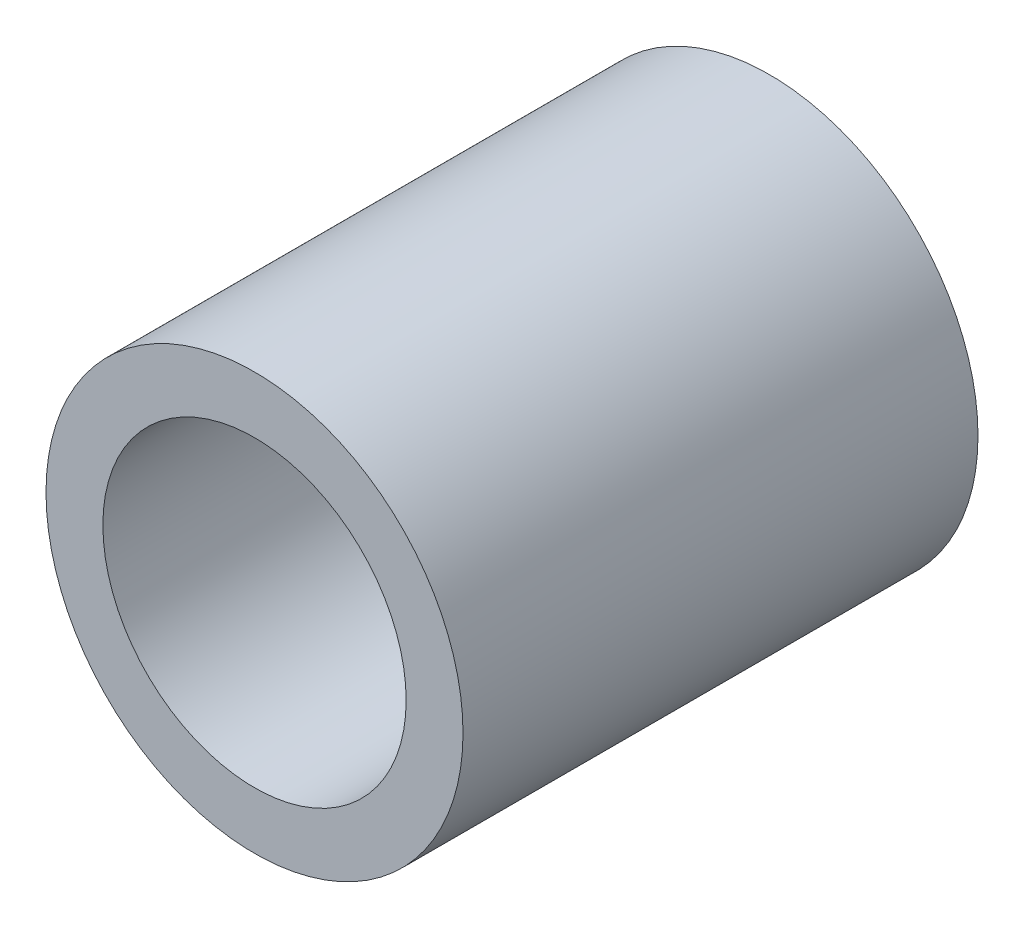
ISO-10303-21;
HEADER;
FILE_DESCRIPTION(('STEP AP214'),'2;1');
FILE_NAME('part.step','',(''),(''),'','','');
FILE_SCHEMA(('AUTOMOTIVE_DESIGN { 1 0 10303 214 1 1 1 1 }'));
ENDSEC;
DATA;
#1=APPLICATION_CONTEXT('core data for automotive mechanical design processes');
#2=APPLICATION_PROTOCOL_DEFINITION('international standard','automotive_design',2000,#1);
#3=PRODUCT_CONTEXT('',#1,'mechanical');
#4=PRODUCT('Part','Part','',(#3));
#5=PRODUCT_RELATED_PRODUCT_CATEGORY('part','',(#4));
#6=PRODUCT_DEFINITION_FORMATION('','',#4);
#7=PRODUCT_DEFINITION_CONTEXT('part definition',#1,'design');
#8=PRODUCT_DEFINITION('design','',#6,#7);
#9=PRODUCT_DEFINITION_SHAPE('','',#8);
#10=(LENGTH_UNIT() NAMED_UNIT(*) SI_UNIT(.MILLI.,.METRE.));
#11=(NAMED_UNIT(*) PLANE_ANGLE_UNIT() SI_UNIT($,.RADIAN.));
#12=(NAMED_UNIT(*) SI_UNIT($,.STERADIAN.) SOLID_ANGLE_UNIT());
#13=UNCERTAINTY_MEASURE_WITH_UNIT(LENGTH_MEASURE(1.E-05),#10,'distance_accuracy_value','');
#14=(GEOMETRIC_REPRESENTATION_CONTEXT(3) GLOBAL_UNCERTAINTY_ASSIGNED_CONTEXT((#13)) GLOBAL_UNIT_ASSIGNED_CONTEXT((#10,
#11,#12)) REPRESENTATION_CONTEXT('',''));
#15=CARTESIAN_POINT('',(0.,0.,0.));
#16=DIRECTION('',(0.,0.,1.));
#17=DIRECTION('',(1.,0.,0.));
#18=AXIS2_PLACEMENT_3D('',#15,#16,#17);
#19=CARTESIAN_POINT('',(0.,0.,0.));
#20=DIRECTION('',(0.,0.,1.));
#21=DIRECTION('',(1.,0.,0.));
#22=AXIS2_PLACEMENT_3D('',#19,#20,#21);
#23=PLANE('',#22);
#24=CARTESIAN_POINT('',(0.,0.,0.));
#25=DIRECTION('',(0.,0.,1.));
#26=DIRECTION('',(1.,0.,0.));
#27=AXIS2_PLACEMENT_3D('',#24,#25,#26);
#28=CIRCLE('',#27,8.73125);
#29=CARTESIAN_POINT('',(-8.73125,0.,0.));
#30=VERTEX_POINT('',#29);
#31=EDGE_CURVE('E38',#30,#30,#28,.T.);
#32=ORIENTED_EDGE('',*,*,#31,.F.);
#33=EDGE_LOOP('',(#32));
#34=FACE_BOUND('',#33,.T.);
#35=CARTESIAN_POINT('',(0.,0.,0.));
#36=DIRECTION('',(0.,0.,1.));
#37=DIRECTION('',(1.,0.,0.));
#38=AXIS2_PLACEMENT_3D('',#35,#36,#37);
#39=CIRCLE('',#38,6.35);
#40=CARTESIAN_POINT('',(-6.35,0.,0.));
#41=VERTEX_POINT('',#40);
#42=EDGE_CURVE('E47',#41,#41,#39,.T.);
#43=ORIENTED_EDGE('',*,*,#42,.T.);
#44=EDGE_LOOP('',(#43));
#45=FACE_BOUND('',#44,.T.);
#46=ADVANCED_FACE('F31',(#34,#45),#23,.F.);
#47=CARTESIAN_POINT('',(0.,0.,46.2602535329402));
#48=DIRECTION('',(0.,0.,-1.));
#49=DIRECTION('',(-1.,0.,0.));
#50=AXIS2_PLACEMENT_3D('',#47,#48,#49);
#51=CYLINDRICAL_SURFACE('',#50,8.73125);
#52=CARTESIAN_POINT('',(0.,0.,21.5645492));
#53=DIRECTION('',(0.,0.,-1.));
#54=DIRECTION('',(0.,1.,0.));
#55=AXIS2_PLACEMENT_3D('',#52,#53,#54);
#56=CIRCLE('',#55,8.73125);
#57=CARTESIAN_POINT('',(-8.73125,0.,21.5645492));
#58=VERTEX_POINT('',#57);
#59=EDGE_CURVE('E42',#58,#58,#56,.T.);
#60=CARTESIAN_POINT('',(-8.73125,0.,21.5645492));
#61=CARTESIAN_POINT('',(-8.73125,0.,21.3399184791667));
#62=CARTESIAN_POINT('',(-8.73125,0.,21.1152877583333));
#63=CARTESIAN_POINT('',(-8.73125,0.,20.6660263166667));
#64=CARTESIAN_POINT('',(-8.73125,0.,20.4413955958333));
#65=CARTESIAN_POINT('',(-8.73125,0.,19.9921341541667));
#66=CARTESIAN_POINT('',(-8.73125,0.,19.7675034333333));
#67=CARTESIAN_POINT('',(-8.73125,0.,19.3182419916667));
#68=CARTESIAN_POINT('',(-8.73125,0.,19.0936112708333));
#69=CARTESIAN_POINT('',(-8.73125,0.,18.6443498291667));
#70=CARTESIAN_POINT('',(-8.73125,0.,18.4197191083333));
#71=CARTESIAN_POINT('',(-8.73125,0.,17.9704576666667));
#72=CARTESIAN_POINT('',(-8.73125,0.,17.7458269458333));
#73=CARTESIAN_POINT('',(-8.73125,0.,17.2965655041667));
#74=CARTESIAN_POINT('',(-8.73125,0.,17.0719347833333));
#75=CARTESIAN_POINT('',(-8.73125,0.,16.6226733416667));
#76=CARTESIAN_POINT('',(-8.73125,0.,16.3980426208333));
#77=CARTESIAN_POINT('',(-8.73125,0.,15.9487811791667));
#78=CARTESIAN_POINT('',(-8.73125,0.,15.7241504583333));
#79=CARTESIAN_POINT('',(-8.73125,0.,15.2748890166667));
#80=CARTESIAN_POINT('',(-8.73125,0.,15.0502582958333));
#81=CARTESIAN_POINT('',(-8.73125,0.,14.6009968541667));
#82=CARTESIAN_POINT('',(-8.73125,0.,14.3763661333333));
#83=CARTESIAN_POINT('',(-8.73125,0.,13.9271046916667));
#84=CARTESIAN_POINT('',(-8.73125,0.,13.7024739708333));
#85=CARTESIAN_POINT('',(-8.73125,0.,13.2532125291667));
#86=CARTESIAN_POINT('',(-8.73125,0.,13.0285818083333));
#87=CARTESIAN_POINT('',(-8.73125,0.,12.5793203666667));
#88=CARTESIAN_POINT('',(-8.73125,0.,12.3546896458333));
#89=CARTESIAN_POINT('',(-8.73125,0.,11.9054282041667));
#90=CARTESIAN_POINT('',(-8.73125,0.,11.6807974833333));
#91=CARTESIAN_POINT('',(-8.73125,0.,11.2315360416667));
#92=CARTESIAN_POINT('',(-8.73125,0.,11.0069053208333));
#93=CARTESIAN_POINT('',(-8.73125,0.,10.5576438791667));
#94=CARTESIAN_POINT('',(-8.73125,0.,10.3330131583333));
#95=CARTESIAN_POINT('',(-8.73125,0.,9.88375171666667));
#96=CARTESIAN_POINT('',(-8.73125,0.,9.65912099583334));
#97=CARTESIAN_POINT('',(-8.73125,0.,9.20985955416667));
#98=CARTESIAN_POINT('',(-8.73125,0.,8.98522883333334));
#99=CARTESIAN_POINT('',(-8.73125,0.,8.53596739166667));
#100=CARTESIAN_POINT('',(-8.73125,0.,8.31133667083334));
#101=CARTESIAN_POINT('',(-8.73125,0.,7.86207522916667));
#102=CARTESIAN_POINT('',(-8.73125,0.,7.63744450833333));
#103=CARTESIAN_POINT('',(-8.73125,0.,7.18818306666667));
#104=CARTESIAN_POINT('',(-8.73125,0.,6.96355234583333));
#105=CARTESIAN_POINT('',(-8.73125,0.,6.51429090416667));
#106=CARTESIAN_POINT('',(-8.73125,0.,6.28966018333333));
#107=CARTESIAN_POINT('',(-8.73125,0.,5.84039874166667));
#108=CARTESIAN_POINT('',(-8.73125,0.,5.61576802083334));
#109=CARTESIAN_POINT('',(-8.73125,0.,5.16650657916667));
#110=CARTESIAN_POINT('',(-8.73125,0.,4.94187585833333));
#111=CARTESIAN_POINT('',(-8.73125,0.,4.49261441666667));
#112=CARTESIAN_POINT('',(-8.73125,0.,4.26798369583333));
#113=CARTESIAN_POINT('',(-8.73125,0.,3.81872225416666));
#114=CARTESIAN_POINT('',(-8.73125,0.,3.59409153333333));
#115=CARTESIAN_POINT('',(-8.73125,0.,3.14483009166666));
#116=CARTESIAN_POINT('',(-8.73125,0.,2.92019937083333));
#117=CARTESIAN_POINT('',(-8.73125,0.,2.47093792916666));
#118=CARTESIAN_POINT('',(-8.73125,0.,2.24630720833333));
#119=CARTESIAN_POINT('',(-8.73125,0.,1.79704576666666));
#120=CARTESIAN_POINT('',(-8.73125,0.,1.57241504583333));
#121=CARTESIAN_POINT('',(-8.73125,0.,1.12315360416666));
#122=CARTESIAN_POINT('',(-8.73125,0.,0.898522883333329));
#123=CARTESIAN_POINT('',(-8.73125,0.,0.449261441666661));
#124=CARTESIAN_POINT('',(-8.73125,0.,0.224630720833327));
#125=CARTESIAN_POINT('',(-8.73125,0.,0.));
#126=B_SPLINE_CURVE_WITH_KNOTS('',3,(#60,#61,#62,#63,#64,#65,#66,#67,#68,#69,#70,#71,#72,#73,
#74,#75,#76,#77,#78,#79,#80,#81,#82,#83,#84,#85,#86,#87,#88,#89,#90,#91,#92,#93,#94,#95,#96,#97,
#98,#99,#100,#101,#102,#103,#104,#105,#106,#107,#108,#109,#110,#111,#112,#113,#114,#115,#116,
#117,#118,#119,#120,#121,#122,#123,#124,#125),.UNSPECIFIED.,.F.,.F.,(4,2,2,2,2,2,2,2,2,2,2,2,2,
2,2,2,2,2,2,2,2,2,2,2,2,2,2,2,2,2,2,2,4),(0.,0.673892162500002,1.347784325,2.0216764875,
2.69556865,3.3694608125,4.043352975,4.71724513750001,5.39113730000001,6.06502946250001,
6.73892162500001,7.4128137875,8.08670595000001,8.76059811250001,9.43449027500001,10.1083824375,
10.7822746,11.4561667625,12.130058925,12.8039510875,13.47784325,14.1517354125,14.825627575,
15.4995197375,16.1734119,16.8473040625,17.521196225,18.1950883875,18.86898055,19.5428727125,
20.216764875,20.8906570375,21.5645492),.UNSPECIFIED.);
#127=EDGE_CURVE('BSEAM55',#58,#30,#126,.T.);
#128=ORIENTED_EDGE('',*,*,#59,.T.);
#129=ORIENTED_EDGE('',*,*,#31,.T.);
#130=ORIENTED_EDGE('',*,*,#127,.T.);
#131=ORIENTED_EDGE('',*,*,#127,.F.);
#132=EDGE_LOOP('',(#128,#130,#129,#131));
#133=FACE_BOUND('',#132,.T.);
#134=ADVANCED_FACE('F55',(#133),#51,.T.);
#135=CARTESIAN_POINT('',(0.,0.,46.2602535329402));
#136=DIRECTION('',(0.,0.,-1.));
#137=DIRECTION('',(-1.,0.,0.));
#138=AXIS2_PLACEMENT_3D('',#135,#136,#137);
#139=CYLINDRICAL_SURFACE('',#138,6.35);
#140=CARTESIAN_POINT('',(0.,0.,21.5645492));
#141=DIRECTION('',(0.,0.,-1.));
#142=DIRECTION('',(0.,1.,0.));
#143=AXIS2_PLACEMENT_3D('',#140,#141,#142);
#144=CIRCLE('',#143,6.35);
#145=CARTESIAN_POINT('',(-6.35,0.,21.5645492));
#146=VERTEX_POINT('',#145);
#147=EDGE_CURVE('E10',#146,#146,#144,.T.);
#148=CARTESIAN_POINT('',(-6.35,0.,21.5645492));
#149=CARTESIAN_POINT('',(-6.35,0.,21.3399184791667));
#150=CARTESIAN_POINT('',(-6.35,0.,21.1152877583333));
#151=CARTESIAN_POINT('',(-6.35,0.,20.6660263166667));
#152=CARTESIAN_POINT('',(-6.35,0.,20.4413955958333));
#153=CARTESIAN_POINT('',(-6.35,0.,19.9921341541667));
#154=CARTESIAN_POINT('',(-6.35,0.,19.7675034333333));
#155=CARTESIAN_POINT('',(-6.35,0.,19.3182419916667));
#156=CARTESIAN_POINT('',(-6.35,0.,19.0936112708333));
#157=CARTESIAN_POINT('',(-6.35,0.,18.6443498291667));
#158=CARTESIAN_POINT('',(-6.35,0.,18.4197191083333));
#159=CARTESIAN_POINT('',(-6.35,0.,17.9704576666667));
#160=CARTESIAN_POINT('',(-6.35,0.,17.7458269458333));
#161=CARTESIAN_POINT('',(-6.35,0.,17.2965655041667));
#162=CARTESIAN_POINT('',(-6.35,0.,17.0719347833333));
#163=CARTESIAN_POINT('',(-6.35,0.,16.6226733416667));
#164=CARTESIAN_POINT('',(-6.35,0.,16.3980426208333));
#165=CARTESIAN_POINT('',(-6.35,0.,15.9487811791667));
#166=CARTESIAN_POINT('',(-6.35,0.,15.7241504583333));
#167=CARTESIAN_POINT('',(-6.35,0.,15.2748890166667));
#168=CARTESIAN_POINT('',(-6.35,0.,15.0502582958333));
#169=CARTESIAN_POINT('',(-6.35,0.,14.6009968541667));
#170=CARTESIAN_POINT('',(-6.35,0.,14.3763661333333));
#171=CARTESIAN_POINT('',(-6.35,0.,13.9271046916667));
#172=CARTESIAN_POINT('',(-6.35,0.,13.7024739708333));
#173=CARTESIAN_POINT('',(-6.35,0.,13.2532125291667));
#174=CARTESIAN_POINT('',(-6.35,0.,13.0285818083333));
#175=CARTESIAN_POINT('',(-6.35,0.,12.5793203666667));
#176=CARTESIAN_POINT('',(-6.35,0.,12.3546896458333));
#177=CARTESIAN_POINT('',(-6.35,0.,11.9054282041667));
#178=CARTESIAN_POINT('',(-6.35,0.,11.6807974833333));
#179=CARTESIAN_POINT('',(-6.35,0.,11.2315360416667));
#180=CARTESIAN_POINT('',(-6.35,0.,11.0069053208333));
#181=CARTESIAN_POINT('',(-6.35,0.,10.5576438791667));
#182=CARTESIAN_POINT('',(-6.35,0.,10.3330131583333));
#183=CARTESIAN_POINT('',(-6.35,0.,9.88375171666667));
#184=CARTESIAN_POINT('',(-6.35,0.,9.65912099583334));
#185=CARTESIAN_POINT('',(-6.35,0.,9.20985955416667));
#186=CARTESIAN_POINT('',(-6.35,0.,8.98522883333334));
#187=CARTESIAN_POINT('',(-6.35,0.,8.53596739166667));
#188=CARTESIAN_POINT('',(-6.35,0.,8.31133667083334));
#189=CARTESIAN_POINT('',(-6.35,0.,7.86207522916667));
#190=CARTESIAN_POINT('',(-6.35,0.,7.63744450833333));
#191=CARTESIAN_POINT('',(-6.35,0.,7.18818306666667));
#192=CARTESIAN_POINT('',(-6.35,0.,6.96355234583333));
#193=CARTESIAN_POINT('',(-6.35,0.,6.51429090416667));
#194=CARTESIAN_POINT('',(-6.35,0.,6.28966018333333));
#195=CARTESIAN_POINT('',(-6.35,0.,5.84039874166667));
#196=CARTESIAN_POINT('',(-6.35,0.,5.61576802083334));
#197=CARTESIAN_POINT('',(-6.35,0.,5.16650657916667));
#198=CARTESIAN_POINT('',(-6.35,0.,4.94187585833333));
#199=CARTESIAN_POINT('',(-6.35,0.,4.49261441666667));
#200=CARTESIAN_POINT('',(-6.35,0.,4.26798369583333));
#201=CARTESIAN_POINT('',(-6.35,0.,3.81872225416666));
#202=CARTESIAN_POINT('',(-6.35,0.,3.59409153333333));
#203=CARTESIAN_POINT('',(-6.35,0.,3.14483009166666));
#204=CARTESIAN_POINT('',(-6.35,0.,2.92019937083333));
#205=CARTESIAN_POINT('',(-6.35,0.,2.47093792916666));
#206=CARTESIAN_POINT('',(-6.35,0.,2.24630720833333));
#207=CARTESIAN_POINT('',(-6.35,0.,1.79704576666666));
#208=CARTESIAN_POINT('',(-6.35,0.,1.57241504583333));
#209=CARTESIAN_POINT('',(-6.35,0.,1.12315360416666));
#210=CARTESIAN_POINT('',(-6.35,0.,0.898522883333329));
#211=CARTESIAN_POINT('',(-6.35,0.,0.449261441666661));
#212=CARTESIAN_POINT('',(-6.35,0.,0.224630720833327));
#213=CARTESIAN_POINT('',(-6.35,0.,0.));
#214=B_SPLINE_CURVE_WITH_KNOTS('',3,(#148,#149,#150,#151,#152,#153,#154,#155,#156,#157,#158,
#159,#160,#161,#162,#163,#164,#165,#166,#167,#168,#169,#170,#171,#172,#173,#174,#175,#176,#177,
#178,#179,#180,#181,#182,#183,#184,#185,#186,#187,#188,#189,#190,#191,#192,#193,#194,#195,#196,
#197,#198,#199,#200,#201,#202,#203,#204,#205,#206,#207,#208,#209,#210,#211,#212,#213),
.UNSPECIFIED.,.F.,.F.,(4,2,2,2,2,2,2,2,2,2,2,2,2,2,2,2,2,2,2,2,2,2,2,2,2,2,2,2,2,2,2,2,4),(0.,
0.673892162500002,1.347784325,2.0216764875,2.69556865,3.3694608125,4.043352975,4.71724513750001,
5.39113730000001,6.06502946250001,6.73892162500001,7.4128137875,8.08670595000001,
8.76059811250001,9.43449027500001,10.1083824375,10.7822746,11.4561667625,12.130058925,
12.8039510875,13.47784325,14.1517354125,14.825627575,15.4995197375,16.1734119,16.8473040625,
17.521196225,18.1950883875,18.86898055,19.5428727125,20.216764875,20.8906570375,21.5645492),.UNSPECIFIED.);
#215=EDGE_CURVE('BSEAM53',#146,#41,#214,.T.);
#216=ORIENTED_EDGE('',*,*,#147,.F.);
#217=ORIENTED_EDGE('',*,*,#42,.F.);
#218=ORIENTED_EDGE('',*,*,#215,.T.);
#219=ORIENTED_EDGE('',*,*,#215,.F.);
#220=EDGE_LOOP('',(#216,#218,#217,#219));
#221=FACE_BOUND('',#220,.T.);
#222=ADVANCED_FACE('F53',(#221),#139,.F.);
#223=CARTESIAN_POINT('',(0.,1.49186218934005E-13,21.5645492));
#224=DIRECTION('',(0.,0.,-1.));
#225=DIRECTION('',(0.866025403784438,-0.500000000000002,0.));
#226=AXIS2_PLACEMENT_3D('',#223,#224,#225);
#227=PLANE('',#226);
#228=ORIENTED_EDGE('',*,*,#147,.T.);
#229=EDGE_LOOP('',(#228));
#230=FACE_BOUND('',#229,.T.);
#231=ORIENTED_EDGE('',*,*,#59,.F.);
#232=EDGE_LOOP('',(#231));
#233=FACE_BOUND('',#232,.T.);
#234=ADVANCED_FACE('F33',(#230,#233),#227,.F.);
#235=CLOSED_SHELL('',(#46,#134,#222,#234));
#236=MANIFOLD_SOLID_BREP('B2',#235);
#237=ADVANCED_BREP_SHAPE_REPRESENTATION('',(#18,#236),#14);
#238=SHAPE_DEFINITION_REPRESENTATION(#9,#237);
ENDSEC;
END-ISO-10303-21;
